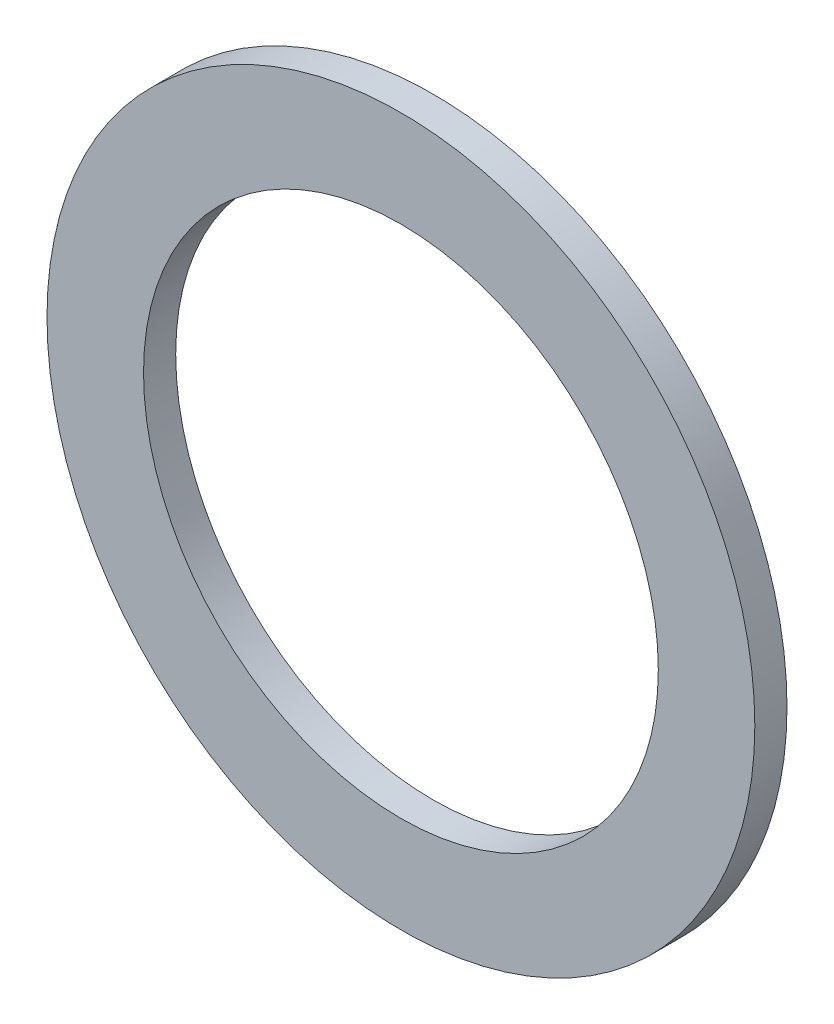
ISO-10303-21;
HEADER;
FILE_DESCRIPTION(('STEP AP214'),'2;1');
FILE_NAME('part.step','',(''),(''),'','','');
FILE_SCHEMA(('AUTOMOTIVE_DESIGN { 1 0 10303 214 1 1 1 1 }'));
ENDSEC;
DATA;
#1=APPLICATION_CONTEXT('core data for automotive mechanical design processes');
#2=APPLICATION_PROTOCOL_DEFINITION('international standard','automotive_design',2000,#1);
#3=PRODUCT_CONTEXT('',#1,'mechanical');
#4=PRODUCT('Part','Part','',(#3));
#5=PRODUCT_RELATED_PRODUCT_CATEGORY('part','',(#4));
#6=PRODUCT_DEFINITION_FORMATION('','',#4);
#7=PRODUCT_DEFINITION_CONTEXT('part definition',#1,'design');
#8=PRODUCT_DEFINITION('design','',#6,#7);
#9=PRODUCT_DEFINITION_SHAPE('','',#8);
#10=(LENGTH_UNIT() NAMED_UNIT(*) SI_UNIT(.MILLI.,.METRE.));
#11=(NAMED_UNIT(*) PLANE_ANGLE_UNIT() SI_UNIT($,.RADIAN.));
#12=(NAMED_UNIT(*) SI_UNIT($,.STERADIAN.) SOLID_ANGLE_UNIT());
#13=UNCERTAINTY_MEASURE_WITH_UNIT(LENGTH_MEASURE(1.E-05),#10,'distance_accuracy_value','');
#14=(GEOMETRIC_REPRESENTATION_CONTEXT(3) GLOBAL_UNCERTAINTY_ASSIGNED_CONTEXT((#13)) GLOBAL_UNIT_ASSIGNED_CONTEXT((#10,
#11,#12)) REPRESENTATION_CONTEXT('',''));
#15=CARTESIAN_POINT('',(0.,0.,0.));
#16=DIRECTION('',(0.,0.,1.));
#17=DIRECTION('',(1.,0.,0.));
#18=AXIS2_PLACEMENT_3D('',#15,#16,#17);
#19=CARTESIAN_POINT('',(0.,0.,0.25));
#20=DIRECTION('',(0.,0.,1.));
#21=DIRECTION('',(1.,0.,0.));
#22=AXIS2_PLACEMENT_3D('',#19,#20,#21);
#23=PLANE('',#22);
#24=CARTESIAN_POINT('',(0.,0.,0.25));
#25=DIRECTION('',(0.,0.,1.));
#26=DIRECTION('',(1.,0.,0.));
#27=AXIS2_PLACEMENT_3D('',#24,#25,#26);
#28=CIRCLE('',#27,2.75);
#29=CARTESIAN_POINT('',(2.75,0.,0.25));
#30=VERTEX_POINT('',#29);
#31=EDGE_CURVE('E10',#30,#30,#28,.T.);
#32=ORIENTED_EDGE('',*,*,#31,.T.);
#33=EDGE_LOOP('',(#32));
#34=FACE_BOUND('',#33,.T.);
#35=CARTESIAN_POINT('',(0.,0.,0.25));
#36=DIRECTION('',(0.,0.,1.));
#37=DIRECTION('',(1.,0.,0.));
#38=AXIS2_PLACEMENT_3D('',#35,#36,#37);
#39=CIRCLE('',#38,2.);
#40=CARTESIAN_POINT('',(2.,0.,0.25));
#41=VERTEX_POINT('',#40);
#42=EDGE_CURVE('E41',#41,#41,#39,.T.);
#43=ORIENTED_EDGE('',*,*,#42,.F.);
#44=EDGE_LOOP('',(#43));
#45=FACE_BOUND('',#44,.T.);
#46=ADVANCED_FACE('F30',(#34,#45),#23,.T.);
#47=CARTESIAN_POINT('',(0.,0.,0.));
#48=DIRECTION('',(0.,0.,1.));
#49=DIRECTION('',(1.,0.,0.));
#50=AXIS2_PLACEMENT_3D('',#47,#48,#49);
#51=PLANE('',#50);
#52=CARTESIAN_POINT('',(0.,0.,0.));
#53=DIRECTION('',(0.,0.,1.));
#54=DIRECTION('',(1.,0.,0.));
#55=AXIS2_PLACEMENT_3D('',#52,#53,#54);
#56=CIRCLE('',#55,2.75);
#57=CARTESIAN_POINT('',(2.75,0.,0.));
#58=VERTEX_POINT('',#57);
#59=EDGE_CURVE('E34',#58,#58,#56,.T.);
#60=ORIENTED_EDGE('',*,*,#59,.F.);
#61=EDGE_LOOP('',(#60));
#62=FACE_BOUND('',#61,.T.);
#63=CARTESIAN_POINT('',(0.,0.,0.));
#64=DIRECTION('',(0.,0.,1.));
#65=DIRECTION('',(1.,0.,0.));
#66=AXIS2_PLACEMENT_3D('',#63,#64,#65);
#67=CIRCLE('',#66,2.);
#68=CARTESIAN_POINT('',(2.,0.,0.));
#69=VERTEX_POINT('',#68);
#70=EDGE_CURVE('E43',#69,#69,#67,.T.);
#71=ORIENTED_EDGE('',*,*,#70,.T.);
#72=EDGE_LOOP('',(#71));
#73=FACE_BOUND('',#72,.T.);
#74=ADVANCED_FACE('F53',(#62,#73),#51,.F.);
#75=CARTESIAN_POINT('',(0.,0.,0.25));
#76=DIRECTION('',(0.,0.,-1.));
#77=DIRECTION('',(-1.,0.,0.));
#78=AXIS2_PLACEMENT_3D('',#75,#76,#77);
#79=CYLINDRICAL_SURFACE('',#78,2.75);
#80=ORIENTED_EDGE('',*,*,#31,.F.);
#81=EDGE_LOOP('',(#80));
#82=FACE_BOUND('',#81,.T.);
#83=ORIENTED_EDGE('',*,*,#59,.T.);
#84=EDGE_LOOP('',(#83));
#85=FACE_BOUND('',#84,.T.);
#86=ADVANCED_FACE('F32',(#82,#85),#79,.T.);
#87=CARTESIAN_POINT('',(0.,0.,0.25));
#88=DIRECTION('',(0.,0.,-1.));
#89=DIRECTION('',(-1.,0.,0.));
#90=AXIS2_PLACEMENT_3D('',#87,#88,#89);
#91=CYLINDRICAL_SURFACE('',#90,2.);
#92=ORIENTED_EDGE('',*,*,#42,.T.);
#93=EDGE_LOOP('',(#92));
#94=FACE_BOUND('',#93,.T.);
#95=ORIENTED_EDGE('',*,*,#70,.F.);
#96=EDGE_LOOP('',(#95));
#97=FACE_BOUND('',#96,.T.);
#98=ADVANCED_FACE('F49',(#94,#97),#91,.F.);
#99=CLOSED_SHELL('',(#46,#74,#86,#98));
#100=MANIFOLD_SOLID_BREP('B2',#99);
#101=ADVANCED_BREP_SHAPE_REPRESENTATION('',(#18,#100),#14);
#102=SHAPE_DEFINITION_REPRESENTATION(#9,#101);
ENDSEC;
END-ISO-10303-21;
